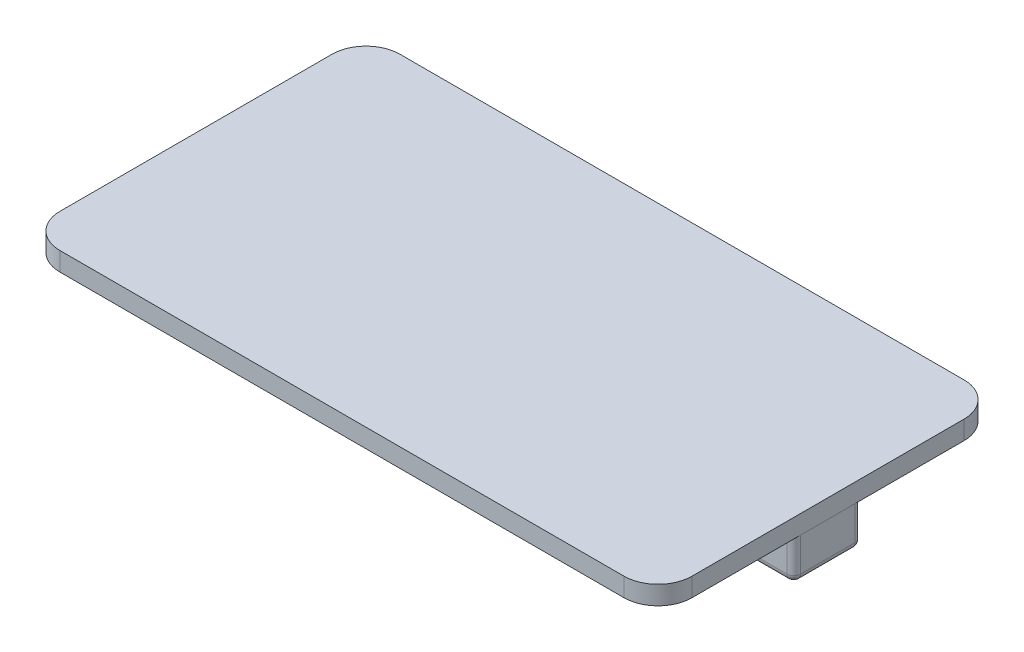
ISO-10303-21;
HEADER;
FILE_DESCRIPTION(('STEP AP214'),'2;1');
FILE_NAME('part.step','',(''),(''),'','','');
FILE_SCHEMA(('AUTOMOTIVE_DESIGN { 1 0 10303 214 1 1 1 1 }'));
ENDSEC;
DATA;
#1=APPLICATION_CONTEXT('core data for automotive mechanical design processes');
#2=APPLICATION_PROTOCOL_DEFINITION('international standard','automotive_design',2000,#1);
#3=PRODUCT_CONTEXT('',#1,'mechanical');
#4=PRODUCT('Part','Part','',(#3));
#5=PRODUCT_RELATED_PRODUCT_CATEGORY('part','',(#4));
#6=PRODUCT_DEFINITION_FORMATION('','',#4);
#7=PRODUCT_DEFINITION_CONTEXT('part definition',#1,'design');
#8=PRODUCT_DEFINITION('design','',#6,#7);
#9=PRODUCT_DEFINITION_SHAPE('','',#8);
#10=(LENGTH_UNIT() NAMED_UNIT(*) SI_UNIT(.MILLI.,.METRE.));
#11=(NAMED_UNIT(*) PLANE_ANGLE_UNIT() SI_UNIT($,.RADIAN.));
#12=(NAMED_UNIT(*) SI_UNIT($,.STERADIAN.) SOLID_ANGLE_UNIT());
#13=UNCERTAINTY_MEASURE_WITH_UNIT(LENGTH_MEASURE(1.E-05),#10,'distance_accuracy_value','');
#14=(GEOMETRIC_REPRESENTATION_CONTEXT(3) GLOBAL_UNCERTAINTY_ASSIGNED_CONTEXT((#13)) GLOBAL_UNIT_ASSIGNED_CONTEXT((#10,
#11,#12)) REPRESENTATION_CONTEXT('',''));
#15=CARTESIAN_POINT('',(0.,0.,0.));
#16=DIRECTION('',(0.,0.,1.));
#17=DIRECTION('',(1.,0.,0.));
#18=AXIS2_PLACEMENT_3D('',#15,#16,#17);
#19=CARTESIAN_POINT('',(-93.,14.,10.));
#20=DIRECTION('',(0.,0.,-1.));
#21=DIRECTION('',(-1.,0.,0.));
#22=AXIS2_PLACEMENT_3D('',#19,#20,#21);
#23=PLANE('',#22);
#24=DIRECTION('',(1.,0.,0.));
#25=VECTOR('',#24,1.);
#26=CARTESIAN_POINT('',(93.,2.,10.));
#27=LINE('',#26,#25);
#28=CARTESIAN_POINT('',(-91.,2.,10.));
#29=VERTEX_POINT('',#28);
#30=CARTESIAN_POINT('',(91.,2.,10.));
#31=VERTEX_POINT('',#30);
#32=EDGE_CURVE('E334',#29,#31,#27,.T.);
#33=ORIENTED_EDGE('',*,*,#32,.T.);
#34=DIRECTION('',(0.,-1.,0.));
#35=VECTOR('',#34,1.);
#36=CARTESIAN_POINT('',(91.,12.,10.));
#37=LINE('',#36,#35);
#38=CARTESIAN_POINT('',(90.9999999999999,12.,10.));
#39=VERTEX_POINT('',#38);
#40=EDGE_CURVE('E413',#31,#39,#37,.F.);
#41=ORIENTED_EDGE('',*,*,#40,.T.);
#42=DIRECTION('',(1.,0.,0.));
#43=VECTOR('',#42,1.);
#44=CARTESIAN_POINT('',(-93.,12.,10.));
#45=LINE('',#44,#43);
#46=CARTESIAN_POINT('',(-91.,12.,10.));
#47=VERTEX_POINT('',#46);
#48=EDGE_CURVE('E269',#47,#39,#45,.T.);
#49=ORIENTED_EDGE('',*,*,#48,.F.);
#50=DIRECTION('',(0.,-1.,0.));
#51=VECTOR('',#50,1.);
#52=CARTESIAN_POINT('',(-91.,14.,10.));
#53=LINE('',#52,#51);
#54=EDGE_CURVE('E365',#47,#29,#53,.T.);
#55=ORIENTED_EDGE('',*,*,#54,.T.);
#56=EDGE_LOOP('',(#33,#41,#49,#55));
#57=FACE_BOUND('',#56,.T.);
#58=ADVANCED_FACE('F41',(#57),#23,.F.);
#59=CARTESIAN_POINT('',(93.,14.,-10.));
#60=DIRECTION('',(1.,0.,0.));
#61=DIRECTION('',(0.,0.,-1.));
#62=AXIS2_PLACEMENT_3D('',#59,#60,#61);
#63=PLANE('',#62);
#64=DIRECTION('',(0.,0.,1.));
#65=VECTOR('',#64,1.);
#66=CARTESIAN_POINT('',(93.,2.,-10.));
#67=LINE('',#66,#65);
#68=CARTESIAN_POINT('',(93.,2.,8.));
#69=VERTEX_POINT('',#68);
#70=CARTESIAN_POINT('',(93.,2.,-8.));
#71=VERTEX_POINT('',#70);
#72=EDGE_CURVE('E401',#69,#71,#67,.F.);
#73=ORIENTED_EDGE('',*,*,#72,.T.);
#74=DIRECTION('',(0.,-1.,0.));
#75=VECTOR('',#74,1.);
#76=CARTESIAN_POINT('',(93.,14.,-8.));
#77=LINE('',#76,#75);
#78=CARTESIAN_POINT('',(93.,12.,-8.));
#79=VERTEX_POINT('',#78);
#80=EDGE_CURVE('E407',#71,#79,#77,.F.);
#81=ORIENTED_EDGE('',*,*,#80,.T.);
#82=DIRECTION('',(0.,0.,-1.));
#83=VECTOR('',#82,1.);
#84=CARTESIAN_POINT('',(93.,12.,-10.));
#85=LINE('',#84,#83);
#86=CARTESIAN_POINT('',(93.,12.,8.));
#87=VERTEX_POINT('',#86);
#88=EDGE_CURVE('E253',#87,#79,#85,.T.);
#89=ORIENTED_EDGE('',*,*,#88,.F.);
#90=DIRECTION('',(0.,-1.,0.));
#91=VECTOR('',#90,1.);
#92=CARTESIAN_POINT('',(93.,2.,8.));
#93=LINE('',#92,#91);
#94=EDGE_CURVE('E404',#87,#69,#93,.T.);
#95=ORIENTED_EDGE('',*,*,#94,.T.);
#96=EDGE_LOOP('',(#73,#81,#89,#95));
#97=FACE_BOUND('',#96,.T.);
#98=ADVANCED_FACE('F488',(#97),#63,.T.);
#99=CARTESIAN_POINT('',(-93.,14.,-10.));
#100=DIRECTION('',(0.,0.,-1.));
#101=DIRECTION('',(-1.,0.,0.));
#102=AXIS2_PLACEMENT_3D('',#99,#100,#101);
#103=PLANE('',#102);
#104=DIRECTION('',(-1.,0.,0.));
#105=VECTOR('',#104,1.);
#106=CARTESIAN_POINT('',(-93.,12.,-10.));
#107=LINE('',#106,#105);
#108=CARTESIAN_POINT('',(90.9999999999999,12.,-10.));
#109=VERTEX_POINT('',#108);
#110=CARTESIAN_POINT('',(-91.,12.,-10.));
#111=VERTEX_POINT('',#110);
#112=EDGE_CURVE('E262',#109,#111,#107,.T.);
#113=ORIENTED_EDGE('',*,*,#112,.F.);
#114=DIRECTION('',(0.,-1.,0.));
#115=VECTOR('',#114,1.);
#116=CARTESIAN_POINT('',(91.,14.,-10.));
#117=LINE('',#116,#115);
#118=CARTESIAN_POINT('',(91.,2.,-10.));
#119=VERTEX_POINT('',#118);
#120=EDGE_CURVE('E381',#109,#119,#117,.T.);
#121=ORIENTED_EDGE('',*,*,#120,.T.);
#122=DIRECTION('',(1.,0.,0.));
#123=VECTOR('',#122,1.);
#124=CARTESIAN_POINT('',(-93.,2.,-10.));
#125=LINE('',#124,#123);
#126=CARTESIAN_POINT('',(-91.,2.,-10.));
#127=VERTEX_POINT('',#126);
#128=EDGE_CURVE('E331',#119,#127,#125,.F.);
#129=ORIENTED_EDGE('',*,*,#128,.T.);
#130=DIRECTION('',(0.,-1.,0.));
#131=VECTOR('',#130,1.);
#132=CARTESIAN_POINT('',(-91.,12.,-10.));
#133=LINE('',#132,#131);
#134=EDGE_CURVE('E350',#127,#111,#133,.F.);
#135=ORIENTED_EDGE('',*,*,#134,.T.);
#136=EDGE_LOOP('',(#113,#121,#129,#135));
#137=FACE_BOUND('',#136,.T.);
#138=ADVANCED_FACE('F482',(#137),#103,.T.);
#139=CARTESIAN_POINT('',(-93.,14.,-10.));
#140=DIRECTION('',(1.,0.,0.));
#141=DIRECTION('',(0.,0.,-1.));
#142=AXIS2_PLACEMENT_3D('',#139,#140,#141);
#143=PLANE('',#142);
#144=DIRECTION('',(0.,0.,1.));
#145=VECTOR('',#144,1.);
#146=CARTESIAN_POINT('',(-93.,12.,-10.));
#147=LINE('',#146,#145);
#148=CARTESIAN_POINT('',(-93.,12.,-8.));
#149=VERTEX_POINT('',#148);
#150=CARTESIAN_POINT('',(-93.,12.,8.));
#151=VERTEX_POINT('',#150);
#152=EDGE_CURVE('E265',#149,#151,#147,.T.);
#153=ORIENTED_EDGE('',*,*,#152,.F.);
#154=DIRECTION('',(0.,-1.,0.));
#155=VECTOR('',#154,1.);
#156=CARTESIAN_POINT('',(-93.,2.,-8.));
#157=LINE('',#156,#155);
#158=CARTESIAN_POINT('',(-93.,2.,-8.));
#159=VERTEX_POINT('',#158);
#160=EDGE_CURVE('E346',#149,#159,#157,.T.);
#161=ORIENTED_EDGE('',*,*,#160,.T.);
#162=DIRECTION('',(0.,0.,1.));
#163=VECTOR('',#162,1.);
#164=CARTESIAN_POINT('',(-93.,2.,8.));
#165=LINE('',#164,#163);
#166=CARTESIAN_POINT('',(-93.,2.,8.));
#167=VERTEX_POINT('',#166);
#168=EDGE_CURVE('E340',#159,#167,#165,.T.);
#169=ORIENTED_EDGE('',*,*,#168,.T.);
#170=DIRECTION('',(0.,-1.,0.));
#171=VECTOR('',#170,1.);
#172=CARTESIAN_POINT('',(-93.,14.,8.));
#173=LINE('',#172,#171);
#174=EDGE_CURVE('E343',#167,#151,#173,.F.);
#175=ORIENTED_EDGE('',*,*,#174,.T.);
#176=EDGE_LOOP('',(#153,#161,#169,#175));
#177=FACE_BOUND('',#176,.T.);
#178=ADVANCED_FACE('F502',(#177),#143,.F.);
#179=CARTESIAN_POINT('',(0.,0.,0.));
#180=DIRECTION('',(0.,-1.,0.));
#181=DIRECTION('',(0.,0.,-1.));
#182=AXIS2_PLACEMENT_3D('',#179,#180,#181);
#183=PLANE('',#182);
#184=DIRECTION('',(0.,0.,1.));
#185=VECTOR('',#184,1.);
#186=CARTESIAN_POINT('',(88.5,0.,5.5));
#187=LINE('',#186,#185);
#188=CARTESIAN_POINT('',(88.5,0.,-5.5));
#189=VERTEX_POINT('',#188);
#190=CARTESIAN_POINT('',(88.5,0.,5.5));
#191=VERTEX_POINT('',#190);
#192=EDGE_CURVE('E207',#189,#191,#187,.T.);
#193=ORIENTED_EDGE('',*,*,#192,.F.);
#194=DIRECTION('',(1.,0.,0.));
#195=VECTOR('',#194,1.);
#196=CARTESIAN_POINT('',(-88.5,0.,-5.5));
#197=LINE('',#196,#195);
#198=CARTESIAN_POINT('',(-88.5,0.,-5.5));
#199=VERTEX_POINT('',#198);
#200=EDGE_CURVE('E227',#199,#189,#197,.T.);
#201=ORIENTED_EDGE('',*,*,#200,.F.);
#202=DIRECTION('',(0.,0.,-1.));
#203=VECTOR('',#202,1.);
#204=CARTESIAN_POINT('',(-88.5,0.,5.5));
#205=LINE('',#204,#203);
#206=CARTESIAN_POINT('',(-88.5,0.,5.5));
#207=VERTEX_POINT('',#206);
#208=EDGE_CURVE('E231',#207,#199,#205,.T.);
#209=ORIENTED_EDGE('',*,*,#208,.F.);
#210=DIRECTION('',(-1.,0.,0.));
#211=VECTOR('',#210,1.);
#212=CARTESIAN_POINT('',(-88.5,0.,5.5));
#213=LINE('',#212,#211);
#214=EDGE_CURVE('E243',#191,#207,#213,.T.);
#215=ORIENTED_EDGE('',*,*,#214,.F.);
#216=EDGE_LOOP('',(#193,#201,#209,#215));
#217=FACE_BOUND('',#216,.T.);
#218=DIRECTION('',(1.,0.,0.));
#219=VECTOR('',#218,1.);
#220=CARTESIAN_POINT('',(0.,0.,-8.));
#221=LINE('',#220,#219);
#222=CARTESIAN_POINT('',(-91.,0.,-8.));
#223=VERTEX_POINT('',#222);
#224=CARTESIAN_POINT('',(91.,0.,-8.));
#225=VERTEX_POINT('',#224);
#226=EDGE_CURVE('E328',#223,#225,#221,.T.);
#227=ORIENTED_EDGE('',*,*,#226,.T.);
#228=DIRECTION('',(0.,0.,1.));
#229=VECTOR('',#228,1.);
#230=CARTESIAN_POINT('',(91.,0.,0.));
#231=LINE('',#230,#229);
#232=CARTESIAN_POINT('',(91.,0.,8.));
#233=VERTEX_POINT('',#232);
#234=EDGE_CURVE('E59',#225,#233,#231,.T.);
#235=ORIENTED_EDGE('',*,*,#234,.T.);
#236=DIRECTION('',(1.,0.,0.));
#237=VECTOR('',#236,1.);
#238=CARTESIAN_POINT('',(-93.,0.,8.));
#239=LINE('',#238,#237);
#240=CARTESIAN_POINT('',(-91.,0.,8.));
#241=VERTEX_POINT('',#240);
#242=EDGE_CURVE('E337',#233,#241,#239,.F.);
#243=ORIENTED_EDGE('',*,*,#242,.T.);
#244=DIRECTION('',(0.,0.,1.));
#245=VECTOR('',#244,1.);
#246=CARTESIAN_POINT('',(-91.,0.,-8.));
#247=LINE('',#246,#245);
#248=EDGE_CURVE('E372',#241,#223,#247,.F.);
#249=ORIENTED_EDGE('',*,*,#248,.T.);
#250=EDGE_LOOP('',(#227,#235,#243,#249));
#251=FACE_BOUND('',#250,.T.);
#252=ADVANCED_FACE('F469',(#217,#251),#183,.T.);
#253=CARTESIAN_POINT('',(0.,12.,0.));
#254=DIRECTION('',(0.,1.,0.));
#255=DIRECTION('',(0.,0.,1.));
#256=AXIS2_PLACEMENT_3D('',#253,#254,#255);
#257=PLANE('',#256);
#258=DIRECTION('',(0.,0.,1.));
#259=VECTOR('',#258,1.);
#260=CARTESIAN_POINT('',(-92.7998455997515,12.,-50.));
#261=LINE('',#260,#259);
#262=CARTESIAN_POINT('',(-92.7998455997515,12.,-8.87209851338898));
#263=VERTEX_POINT('',#262);
#264=CARTESIAN_POINT('',(-92.7998455997515,12.,8.87209851338898));
#265=VERTEX_POINT('',#264);
#266=EDGE_CURVE('E273',#263,#265,#261,.T.);
#267=ORIENTED_EDGE('',*,*,#266,.F.);
#268=CARTESIAN_POINT('',(-91.,12.,-8.));
#269=DIRECTION('',(0.,1.,0.));
#270=DIRECTION('',(0.,0.,1.));
#271=AXIS2_PLACEMENT_3D('',#268,#269,#270);
#272=CIRCLE('',#271,2.);
#273=EDGE_CURVE('E358',#263,#149,#272,.T.);
#274=ORIENTED_EDGE('',*,*,#273,.T.);
#275=ORIENTED_EDGE('',*,*,#152,.T.);
#276=CARTESIAN_POINT('',(-91.,12.,8.));
#277=DIRECTION('',(0.,1.,0.));
#278=DIRECTION('',(0.,0.,1.));
#279=AXIS2_PLACEMENT_3D('',#276,#277,#278);
#280=CIRCLE('',#279,2.);
#281=EDGE_CURVE('E354',#151,#265,#280,.T.);
#282=ORIENTED_EDGE('',*,*,#281,.T.);
#283=EDGE_LOOP('',(#267,#274,#275,#282));
#284=FACE_BOUND('',#283,.T.);
#285=ADVANCED_FACE('F498',(#284),#257,.T.);
#286=CARTESIAN_POINT('',(88.5,4.,5.5));
#287=DIRECTION('',(1.,0.,0.));
#288=DIRECTION('',(0.,0.,-1.));
#289=AXIS2_PLACEMENT_3D('',#286,#287,#288);
#290=PLANE('',#289);
#291=ORIENTED_EDGE('',*,*,#192,.T.);
#292=DIRECTION('',(0.,-1.,0.));
#293=VECTOR('',#292,1.);
#294=CARTESIAN_POINT('',(88.5,4.,5.5));
#295=LINE('',#294,#293);
#296=CARTESIAN_POINT('',(88.5,4.,5.5));
#297=VERTEX_POINT('',#296);
#298=EDGE_CURVE('E200',#297,#191,#295,.T.);
#299=ORIENTED_EDGE('',*,*,#298,.F.);
#300=DIRECTION('',(0.,0.,1.));
#301=VECTOR('',#300,1.);
#302=CARTESIAN_POINT('',(88.5,4.,5.5));
#303=LINE('',#302,#301);
#304=CARTESIAN_POINT('',(88.5,4.,-5.5));
#305=VERTEX_POINT('',#304);
#306=EDGE_CURVE('E204',#305,#297,#303,.T.);
#307=ORIENTED_EDGE('',*,*,#306,.F.);
#308=DIRECTION('',(0.,-1.,0.));
#309=VECTOR('',#308,1.);
#310=CARTESIAN_POINT('',(88.5,4.,-5.5));
#311=LINE('',#310,#309);
#312=EDGE_CURVE('E250',#305,#189,#311,.T.);
#313=ORIENTED_EDGE('',*,*,#312,.T.);
#314=EDGE_LOOP('',(#291,#299,#307,#313));
#315=FACE_BOUND('',#314,.T.);
#316=ADVANCED_FACE('F202',(#315),#290,.F.);
#317=CARTESIAN_POINT('',(-88.5,4.,-5.5));
#318=DIRECTION('',(0.,0.,-1.));
#319=DIRECTION('',(-1.,0.,0.));
#320=AXIS2_PLACEMENT_3D('',#317,#318,#319);
#321=PLANE('',#320);
#322=ORIENTED_EDGE('',*,*,#200,.T.);
#323=ORIENTED_EDGE('',*,*,#312,.F.);
#324=DIRECTION('',(1.,0.,0.));
#325=VECTOR('',#324,1.);
#326=CARTESIAN_POINT('',(-88.5,4.,-5.5));
#327=LINE('',#326,#325);
#328=CARTESIAN_POINT('',(-88.5,4.,-5.5));
#329=VERTEX_POINT('',#328);
#330=EDGE_CURVE('E213',#329,#305,#327,.T.);
#331=ORIENTED_EDGE('',*,*,#330,.F.);
#332=DIRECTION('',(0.,-1.,0.));
#333=VECTOR('',#332,1.);
#334=CARTESIAN_POINT('',(-88.5,4.,-5.5));
#335=LINE('',#334,#333);
#336=EDGE_CURVE('E254',#329,#199,#335,.T.);
#337=ORIENTED_EDGE('',*,*,#336,.T.);
#338=EDGE_LOOP('',(#322,#323,#331,#337));
#339=FACE_BOUND('',#338,.T.);
#340=ADVANCED_FACE('F739',(#339),#321,.F.);
#341=CARTESIAN_POINT('',(-88.5,4.,5.5));
#342=DIRECTION('',(-1.,0.,0.));
#343=DIRECTION('',(0.,0.,1.));
#344=AXIS2_PLACEMENT_3D('',#341,#342,#343);
#345=PLANE('',#344);
#346=ORIENTED_EDGE('',*,*,#208,.T.);
#347=ORIENTED_EDGE('',*,*,#336,.F.);
#348=DIRECTION('',(0.,0.,-1.));
#349=VECTOR('',#348,1.);
#350=CARTESIAN_POINT('',(-88.5,4.,5.5));
#351=LINE('',#350,#349);
#352=CARTESIAN_POINT('',(-88.5,4.,5.5));
#353=VERTEX_POINT('',#352);
#354=EDGE_CURVE('E222',#353,#329,#351,.T.);
#355=ORIENTED_EDGE('',*,*,#354,.F.);
#356=DIRECTION('',(0.,-1.,0.));
#357=VECTOR('',#356,1.);
#358=CARTESIAN_POINT('',(-88.5,4.,5.5));
#359=LINE('',#358,#357);
#360=EDGE_CURVE('E212',#353,#207,#359,.T.);
#361=ORIENTED_EDGE('',*,*,#360,.T.);
#362=EDGE_LOOP('',(#346,#347,#355,#361));
#363=FACE_BOUND('',#362,.T.);
#364=ADVANCED_FACE('F732',(#363),#345,.F.);
#365=CARTESIAN_POINT('',(-88.5,4.,5.5));
#366=DIRECTION('',(0.,0.,1.));
#367=DIRECTION('',(1.,0.,0.));
#368=AXIS2_PLACEMENT_3D('',#365,#366,#367);
#369=PLANE('',#368);
#370=ORIENTED_EDGE('',*,*,#214,.T.);
#371=ORIENTED_EDGE('',*,*,#360,.F.);
#372=DIRECTION('',(-1.,0.,0.));
#373=VECTOR('',#372,1.);
#374=CARTESIAN_POINT('',(-88.5,4.,5.5));
#375=LINE('',#374,#373);
#376=EDGE_CURVE('E216',#297,#353,#375,.T.);
#377=ORIENTED_EDGE('',*,*,#376,.F.);
#378=ORIENTED_EDGE('',*,*,#298,.T.);
#379=EDGE_LOOP('',(#370,#371,#377,#378));
#380=FACE_BOUND('',#379,.T.);
#381=ADVANCED_FACE('F217',(#380),#369,.F.);
#382=CARTESIAN_POINT('',(0.,4.,0.));
#383=DIRECTION('',(0.,-1.,0.));
#384=DIRECTION('',(0.,0.,-1.));
#385=AXIS2_PLACEMENT_3D('',#382,#383,#384);
#386=PLANE('',#385);
#387=CARTESIAN_POINT('',(-72.,4.,0.));
#388=DIRECTION('',(0.,-1.,0.));
#389=DIRECTION('',(0.,0.,-1.));
#390=AXIS2_PLACEMENT_3D('',#387,#388,#389);
#391=CIRCLE('',#390,2.75000000000001);
#392=CARTESIAN_POINT('',(-72.,4.,-2.75000000000001));
#393=VERTEX_POINT('',#392);
#394=EDGE_CURVE('E885',#393,#393,#391,.T.);
#395=ORIENTED_EDGE('',*,*,#394,.F.);
#396=EDGE_LOOP('',(#395));
#397=FACE_BOUND('',#396,.T.);
#398=CARTESIAN_POINT('',(-38.,4.,0.));
#399=DIRECTION('',(0.,-1.,0.));
#400=DIRECTION('',(0.,0.,-1.));
#401=AXIS2_PLACEMENT_3D('',#398,#399,#400);
#402=CIRCLE('',#401,2.75);
#403=CARTESIAN_POINT('',(-38.,4.,-2.75));
#404=VERTEX_POINT('',#403);
#405=EDGE_CURVE('E889',#404,#404,#402,.T.);
#406=ORIENTED_EDGE('',*,*,#405,.F.);
#407=EDGE_LOOP('',(#406));
#408=FACE_BOUND('',#407,.T.);
#409=CARTESIAN_POINT('',(38.,4.,0.));
#410=DIRECTION('',(0.,-1.,0.));
#411=DIRECTION('',(0.,0.,-1.));
#412=AXIS2_PLACEMENT_3D('',#409,#410,#411);
#413=CIRCLE('',#412,2.75);
#414=CARTESIAN_POINT('',(38.,4.,-2.75));
#415=VERTEX_POINT('',#414);
#416=EDGE_CURVE('E893',#415,#415,#413,.T.);
#417=ORIENTED_EDGE('',*,*,#416,.F.);
#418=EDGE_LOOP('',(#417));
#419=FACE_BOUND('',#418,.T.);
#420=CARTESIAN_POINT('',(72.,4.,0.));
#421=DIRECTION('',(0.,-1.,0.));
#422=DIRECTION('',(0.,0.,-1.));
#423=AXIS2_PLACEMENT_3D('',#420,#421,#422);
#424=CIRCLE('',#423,2.75000000000001);
#425=CARTESIAN_POINT('',(72.,4.,-2.75000000000001));
#426=VERTEX_POINT('',#425);
#427=EDGE_CURVE('E234',#426,#426,#424,.T.);
#428=ORIENTED_EDGE('',*,*,#427,.F.);
#429=EDGE_LOOP('',(#428));
#430=FACE_BOUND('',#429,.T.);
#431=ORIENTED_EDGE('',*,*,#306,.T.);
#432=ORIENTED_EDGE('',*,*,#376,.T.);
#433=ORIENTED_EDGE('',*,*,#354,.T.);
#434=ORIENTED_EDGE('',*,*,#330,.T.);
#435=EDGE_LOOP('',(#431,#432,#433,#434));
#436=FACE_BOUND('',#435,.T.);
#437=ADVANCED_FACE('F224',(#397,#408,#419,#430,#436),#386,.T.);
#438=CARTESIAN_POINT('',(72.,9.5,0.));
#439=DIRECTION('',(0.,-1.,0.));
#440=DIRECTION('',(0.,0.,-1.));
#441=AXIS2_PLACEMENT_3D('',#438,#439,#440);
#442=CYLINDRICAL_SURFACE('',#441,2.75000000000001);
#443=CARTESIAN_POINT('',(72.,9.5,0.));
#444=DIRECTION('',(0.,-1.,0.));
#445=DIRECTION('',(0.,0.,-1.));
#446=AXIS2_PLACEMENT_3D('',#443,#444,#445);
#447=CIRCLE('',#446,2.75000000000001);
#448=CARTESIAN_POINT('',(72.,9.5,-2.75000000000001));
#449=VERTEX_POINT('',#448);
#450=EDGE_CURVE('E898',#449,#449,#447,.T.);
#451=ORIENTED_EDGE('',*,*,#450,.F.);
#452=EDGE_LOOP('',(#451));
#453=FACE_BOUND('',#452,.T.);
#454=ORIENTED_EDGE('',*,*,#427,.T.);
#455=EDGE_LOOP('',(#454));
#456=FACE_BOUND('',#455,.T.);
#457=ADVANCED_FACE('F710',(#453,#456),#442,.F.);
#458=CARTESIAN_POINT('',(72.,9.5,0.));
#459=DIRECTION('',(0.,-1.,0.));
#460=DIRECTION('',(0.,0.,-1.));
#461=AXIS2_PLACEMENT_3D('',#458,#459,#460);
#462=PLANE('',#461);
#463=ORIENTED_EDGE('',*,*,#450,.T.);
#464=EDGE_LOOP('',(#463));
#465=FACE_BOUND('',#464,.T.);
#466=ADVANCED_FACE('F702',(#465),#462,.T.);
#467=CARTESIAN_POINT('',(38.,9.5,0.));
#468=DIRECTION('',(0.,-1.,0.));
#469=DIRECTION('',(0.,0.,-1.));
#470=AXIS2_PLACEMENT_3D('',#467,#468,#469);
#471=CYLINDRICAL_SURFACE('',#470,2.75);
#472=CARTESIAN_POINT('',(38.,9.5,0.));
#473=DIRECTION('',(0.,-1.,0.));
#474=DIRECTION('',(0.,0.,-1.));
#475=AXIS2_PLACEMENT_3D('',#472,#473,#474);
#476=CIRCLE('',#475,2.75);
#477=CARTESIAN_POINT('',(38.,9.5,-2.75));
#478=VERTEX_POINT('',#477);
#479=EDGE_CURVE('E939',#478,#478,#476,.T.);
#480=ORIENTED_EDGE('',*,*,#479,.F.);
#481=EDGE_LOOP('',(#480));
#482=FACE_BOUND('',#481,.T.);
#483=ORIENTED_EDGE('',*,*,#416,.T.);
#484=EDGE_LOOP('',(#483));
#485=FACE_BOUND('',#484,.T.);
#486=ADVANCED_FACE('F694',(#482,#485),#471,.F.);
#487=CARTESIAN_POINT('',(38.,9.5,0.));
#488=DIRECTION('',(0.,-1.,0.));
#489=DIRECTION('',(0.,0.,-1.));
#490=AXIS2_PLACEMENT_3D('',#487,#488,#489);
#491=PLANE('',#490);
#492=ORIENTED_EDGE('',*,*,#479,.T.);
#493=EDGE_LOOP('',(#492));
#494=FACE_BOUND('',#493,.T.);
#495=ADVANCED_FACE('F686',(#494),#491,.T.);
#496=CARTESIAN_POINT('',(-38.,9.5,0.));
#497=DIRECTION('',(0.,-1.,0.));
#498=DIRECTION('',(0.,0.,-1.));
#499=AXIS2_PLACEMENT_3D('',#496,#497,#498);
#500=CYLINDRICAL_SURFACE('',#499,2.75);
#501=CARTESIAN_POINT('',(-38.,9.5,0.));
#502=DIRECTION('',(0.,-1.,0.));
#503=DIRECTION('',(0.,0.,-1.));
#504=AXIS2_PLACEMENT_3D('',#501,#502,#503);
#505=CIRCLE('',#504,2.75);
#506=CARTESIAN_POINT('',(-38.,9.5,-2.75));
#507=VERTEX_POINT('',#506);
#508=EDGE_CURVE('E933',#507,#507,#505,.T.);
#509=ORIENTED_EDGE('',*,*,#508,.F.);
#510=EDGE_LOOP('',(#509));
#511=FACE_BOUND('',#510,.T.);
#512=ORIENTED_EDGE('',*,*,#405,.T.);
#513=EDGE_LOOP('',(#512));
#514=FACE_BOUND('',#513,.T.);
#515=ADVANCED_FACE('F678',(#511,#514),#500,.F.);
#516=CARTESIAN_POINT('',(-38.,9.5,0.));
#517=DIRECTION('',(0.,-1.,0.));
#518=DIRECTION('',(0.,0.,-1.));
#519=AXIS2_PLACEMENT_3D('',#516,#517,#518);
#520=PLANE('',#519);
#521=ORIENTED_EDGE('',*,*,#508,.T.);
#522=EDGE_LOOP('',(#521));
#523=FACE_BOUND('',#522,.T.);
#524=ADVANCED_FACE('F670',(#523),#520,.T.);
#525=CARTESIAN_POINT('',(-72.,9.5,0.));
#526=DIRECTION('',(0.,-1.,0.));
#527=DIRECTION('',(0.,0.,-1.));
#528=AXIS2_PLACEMENT_3D('',#525,#526,#527);
#529=CYLINDRICAL_SURFACE('',#528,2.75000000000001);
#530=CARTESIAN_POINT('',(-72.,9.5,0.));
#531=DIRECTION('',(0.,-1.,0.));
#532=DIRECTION('',(0.,0.,-1.));
#533=AXIS2_PLACEMENT_3D('',#530,#531,#532);
#534=CIRCLE('',#533,2.75000000000001);
#535=CARTESIAN_POINT('',(-72.,9.5,-2.75000000000001));
#536=VERTEX_POINT('',#535);
#537=EDGE_CURVE('E244',#536,#536,#534,.T.);
#538=ORIENTED_EDGE('',*,*,#537,.F.);
#539=EDGE_LOOP('',(#538));
#540=FACE_BOUND('',#539,.T.);
#541=ORIENTED_EDGE('',*,*,#394,.T.);
#542=EDGE_LOOP('',(#541));
#543=FACE_BOUND('',#542,.T.);
#544=ADVANCED_FACE('F662',(#540,#543),#529,.F.);
#545=CARTESIAN_POINT('',(-72.,9.5,0.));
#546=DIRECTION('',(0.,-1.,0.));
#547=DIRECTION('',(0.,0.,-1.));
#548=AXIS2_PLACEMENT_3D('',#545,#546,#547);
#549=PLANE('',#548);
#550=ORIENTED_EDGE('',*,*,#537,.T.);
#551=EDGE_LOOP('',(#550));
#552=FACE_BOUND('',#551,.T.);
#553=ADVANCED_FACE('F655',(#552),#549,.T.);
#554=CARTESIAN_POINT('',(0.,12.,0.));
#555=DIRECTION('',(0.,1.,0.));
#556=DIRECTION('',(0.,0.,1.));
#557=AXIS2_PLACEMENT_3D('',#554,#555,#556);
#558=PLANE('',#557);
#559=CARTESIAN_POINT('',(-92.7998455997515,12.,-40.));
#560=VERTEX_POINT('',#559);
#561=EDGE_CURVE('E279',#560,#263,#261,.T.);
#562=ORIENTED_EDGE('',*,*,#561,.F.);
#563=CARTESIAN_POINT('',(-82.7998455997515,12.,-40.));
#564=DIRECTION('',(0.,1.,0.));
#565=DIRECTION('',(0.,0.,1.));
#566=AXIS2_PLACEMENT_3D('',#563,#564,#565);
#567=CIRCLE('',#566,10.);
#568=CARTESIAN_POINT('',(-82.7998455997515,12.,-50.));
#569=VERTEX_POINT('',#568);
#570=EDGE_CURVE('E319',#560,#569,#567,.F.);
#571=ORIENTED_EDGE('',*,*,#570,.T.);
#572=DIRECTION('',(-1.,0.,0.));
#573=VECTOR('',#572,1.);
#574=CARTESIAN_POINT('',(93.0804195849359,12.,-50.));
#575=LINE('',#574,#573);
#576=CARTESIAN_POINT('',(83.0804195849359,12.,-50.));
#577=VERTEX_POINT('',#576);
#578=EDGE_CURVE('E397',#577,#569,#575,.T.);
#579=ORIENTED_EDGE('',*,*,#578,.F.);
#580=CARTESIAN_POINT('',(83.0804195849359,12.,-40.));
#581=DIRECTION('',(0.,1.,0.));
#582=DIRECTION('',(0.,0.,1.));
#583=AXIS2_PLACEMENT_3D('',#580,#581,#582);
#584=CIRCLE('',#583,10.);
#585=CARTESIAN_POINT('',(93.0804195849359,12.,-40.));
#586=VERTEX_POINT('',#585);
#587=EDGE_CURVE('E306',#577,#586,#584,.F.);
#588=ORIENTED_EDGE('',*,*,#587,.T.);
#589=DIRECTION('',(0.,0.,-1.));
#590=VECTOR('',#589,1.);
#591=CARTESIAN_POINT('',(93.0804195849359,12.,50.));
#592=LINE('',#591,#590);
#593=CARTESIAN_POINT('',(93.0804195849359,12.,40.));
#594=VERTEX_POINT('',#593);
#595=EDGE_CURVE('E923',#594,#586,#592,.T.);
#596=ORIENTED_EDGE('',*,*,#595,.F.);
#597=CARTESIAN_POINT('',(83.0804195849359,12.,40.));
#598=DIRECTION('',(0.,1.,0.));
#599=DIRECTION('',(0.,0.,1.));
#600=AXIS2_PLACEMENT_3D('',#597,#598,#599);
#601=CIRCLE('',#600,10.);
#602=CARTESIAN_POINT('',(83.0804195849359,12.,50.));
#603=VERTEX_POINT('',#602);
#604=EDGE_CURVE('E293',#594,#603,#601,.F.);
#605=ORIENTED_EDGE('',*,*,#604,.T.);
#606=DIRECTION('',(1.,0.,0.));
#607=VECTOR('',#606,1.);
#608=CARTESIAN_POINT('',(-92.7998455997515,12.,50.));
#609=LINE('',#608,#607);
#610=CARTESIAN_POINT('',(-82.7998455997515,12.,50.));
#611=VERTEX_POINT('',#610);
#612=EDGE_CURVE('E919',#611,#603,#609,.T.);
#613=ORIENTED_EDGE('',*,*,#612,.F.);
#614=CARTESIAN_POINT('',(-82.7998455997515,12.,40.));
#615=DIRECTION('',(0.,1.,0.));
#616=DIRECTION('',(0.,0.,1.));
#617=AXIS2_PLACEMENT_3D('',#614,#615,#616);
#618=CIRCLE('',#617,10.);
#619=CARTESIAN_POINT('',(-92.7998455997515,12.,40.));
#620=VERTEX_POINT('',#619);
#621=EDGE_CURVE('E278',#611,#620,#618,.F.);
#622=ORIENTED_EDGE('',*,*,#621,.T.);
#623=EDGE_CURVE('E451',#265,#620,#261,.T.);
#624=ORIENTED_EDGE('',*,*,#623,.F.);
#625=CARTESIAN_POINT('',(-91.,12.,8.));
#626=DIRECTION('',(0.,1.,0.));
#627=DIRECTION('',(0.,0.,1.));
#628=AXIS2_PLACEMENT_3D('',#625,#626,#627);
#629=CIRCLE('',#628,2.);
#630=EDGE_CURVE('E378',#265,#47,#629,.T.);
#631=ORIENTED_EDGE('',*,*,#630,.T.);
#632=ORIENTED_EDGE('',*,*,#48,.T.);
#633=CARTESIAN_POINT('',(91.,12.,8.));
#634=DIRECTION('',(0.,1.,0.));
#635=DIRECTION('',(0.,0.,1.));
#636=AXIS2_PLACEMENT_3D('',#633,#634,#635);
#637=CIRCLE('',#636,2.);
#638=EDGE_CURVE('E11',#39,#87,#637,.T.);
#639=ORIENTED_EDGE('',*,*,#638,.T.);
#640=ORIENTED_EDGE('',*,*,#88,.T.);
#641=CARTESIAN_POINT('',(91.,12.,-8.));
#642=DIRECTION('',(0.,1.,0.));
#643=DIRECTION('',(0.,0.,1.));
#644=AXIS2_PLACEMENT_3D('',#641,#642,#643);
#645=CIRCLE('',#644,2.);
#646=EDGE_CURVE('E51',#79,#109,#645,.T.);
#647=ORIENTED_EDGE('',*,*,#646,.T.);
#648=ORIENTED_EDGE('',*,*,#112,.T.);
#649=CARTESIAN_POINT('',(-91.,12.,-8.));
#650=DIRECTION('',(0.,1.,0.));
#651=DIRECTION('',(0.,0.,1.));
#652=AXIS2_PLACEMENT_3D('',#649,#650,#651);
#653=CIRCLE('',#652,2.);
#654=EDGE_CURVE('E375',#111,#263,#653,.T.);
#655=ORIENTED_EDGE('',*,*,#654,.T.);
#656=EDGE_LOOP('',(#562,#571,#579,#588,#596,#605,#613,#622,#624,#631,#632,#639,#640,#647,#648,#655));
#657=FACE_BOUND('',#656,.T.);
#658=ADVANCED_FACE('F447',(#657),#558,.F.);
#659=CARTESIAN_POINT('',(93.0804195849359,17.5,-50.));
#660=DIRECTION('',(0.,0.,1.));
#661=DIRECTION('',(1.,0.,0.));
#662=AXIS2_PLACEMENT_3D('',#659,#660,#661);
#663=PLANE('',#662);
#664=ORIENTED_EDGE('',*,*,#578,.T.);
#665=DIRECTION('',(0.,-1.,0.));
#666=VECTOR('',#665,1.);
#667=CARTESIAN_POINT('',(-82.7998455997515,17.5,-50.));
#668=LINE('',#667,#666);
#669=CARTESIAN_POINT('',(-82.7998455997515,17.5,-50.));
#670=VERTEX_POINT('',#669);
#671=EDGE_CURVE('E322',#569,#670,#668,.F.);
#672=ORIENTED_EDGE('',*,*,#671,.T.);
#673=DIRECTION('',(-1.,0.,0.));
#674=VECTOR('',#673,1.);
#675=CARTESIAN_POINT('',(93.0804195849359,17.5,-50.));
#676=LINE('',#675,#674);
#677=CARTESIAN_POINT('',(83.0804195849359,17.5,-50.));
#678=VERTEX_POINT('',#677);
#679=EDGE_CURVE('E927',#678,#670,#676,.T.);
#680=ORIENTED_EDGE('',*,*,#679,.F.);
#681=DIRECTION('',(0.,-1.,0.));
#682=VECTOR('',#681,1.);
#683=CARTESIAN_POINT('',(83.0804195849359,17.5,-50.));
#684=LINE('',#683,#682);
#685=EDGE_CURVE('E302',#678,#577,#684,.T.);
#686=ORIENTED_EDGE('',*,*,#685,.T.);
#687=EDGE_LOOP('',(#664,#672,#680,#686));
#688=FACE_BOUND('',#687,.T.);
#689=ADVANCED_FACE('F641',(#688),#663,.F.);
#690=CARTESIAN_POINT('',(-92.7998455997515,17.5,-50.));
#691=DIRECTION('',(1.,0.,0.));
#692=DIRECTION('',(0.,0.,-1.));
#693=AXIS2_PLACEMENT_3D('',#690,#691,#692);
#694=PLANE('',#693);
#695=DIRECTION('',(0.,0.,1.));
#696=VECTOR('',#695,1.);
#697=CARTESIAN_POINT('',(-92.7998455997515,17.5,-50.));
#698=LINE('',#697,#696);
#699=CARTESIAN_POINT('',(-92.7998455997515,17.5,-40.));
#700=VERTEX_POINT('',#699);
#701=CARTESIAN_POINT('',(-92.7998455997515,17.5,40.));
#702=VERTEX_POINT('',#701);
#703=EDGE_CURVE('E910',#700,#702,#698,.T.);
#704=ORIENTED_EDGE('',*,*,#703,.F.);
#705=DIRECTION('',(0.,-1.,0.));
#706=VECTOR('',#705,1.);
#707=CARTESIAN_POINT('',(-92.7998455997515,17.5,-40.));
#708=LINE('',#707,#706);
#709=EDGE_CURVE('E315',#700,#560,#708,.T.);
#710=ORIENTED_EDGE('',*,*,#709,.T.);
#711=ORIENTED_EDGE('',*,*,#561,.T.);
#712=ORIENTED_EDGE('',*,*,#266,.T.);
#713=ORIENTED_EDGE('',*,*,#623,.T.);
#714=DIRECTION('',(0.,-1.,0.));
#715=VECTOR('',#714,1.);
#716=CARTESIAN_POINT('',(-92.7998455997515,17.5,40.));
#717=LINE('',#716,#715);
#718=EDGE_CURVE('E282',#620,#702,#717,.F.);
#719=ORIENTED_EDGE('',*,*,#718,.T.);
#720=EDGE_LOOP('',(#704,#710,#711,#712,#713,#719));
#721=FACE_BOUND('',#720,.T.);
#722=ADVANCED_FACE('F634',(#721),#694,.F.);
#723=CARTESIAN_POINT('',(-92.7998455997515,17.5,50.));
#724=DIRECTION('',(0.,0.,-1.));
#725=DIRECTION('',(-1.,0.,0.));
#726=AXIS2_PLACEMENT_3D('',#723,#724,#725);
#727=PLANE('',#726);
#728=ORIENTED_EDGE('',*,*,#612,.T.);
#729=DIRECTION('',(0.,-1.,0.));
#730=VECTOR('',#729,1.);
#731=CARTESIAN_POINT('',(83.0804195849359,17.5,50.));
#732=LINE('',#731,#730);
#733=CARTESIAN_POINT('',(83.0804195849359,17.5,50.));
#734=VERTEX_POINT('',#733);
#735=EDGE_CURVE('E296',#603,#734,#732,.F.);
#736=ORIENTED_EDGE('',*,*,#735,.T.);
#737=DIRECTION('',(1.,0.,0.));
#738=VECTOR('',#737,1.);
#739=CARTESIAN_POINT('',(-92.7998455997515,17.5,50.));
#740=LINE('',#739,#738);
#741=CARTESIAN_POINT('',(-82.7998455997515,17.5,50.));
#742=VERTEX_POINT('',#741);
#743=EDGE_CURVE('E904',#742,#734,#740,.T.);
#744=ORIENTED_EDGE('',*,*,#743,.F.);
#745=DIRECTION('',(0.,-1.,0.));
#746=VECTOR('',#745,1.);
#747=CARTESIAN_POINT('',(-82.7998455997515,17.5,50.));
#748=LINE('',#747,#746);
#749=EDGE_CURVE('E274',#742,#611,#748,.T.);
#750=ORIENTED_EDGE('',*,*,#749,.T.);
#751=EDGE_LOOP('',(#728,#736,#744,#750));
#752=FACE_BOUND('',#751,.T.);
#753=ADVANCED_FACE('F627',(#752),#727,.F.);
#754=CARTESIAN_POINT('',(93.0804195849359,17.5,50.));
#755=DIRECTION('',(-1.,0.,0.));
#756=DIRECTION('',(0.,0.,1.));
#757=AXIS2_PLACEMENT_3D('',#754,#755,#756);
#758=PLANE('',#757);
#759=ORIENTED_EDGE('',*,*,#595,.T.);
#760=DIRECTION('',(0.,-1.,0.));
#761=VECTOR('',#760,1.);
#762=CARTESIAN_POINT('',(93.0804195849359,17.5,-40.));
#763=LINE('',#762,#761);
#764=CARTESIAN_POINT('',(93.0804195849359,17.5,-40.));
#765=VERTEX_POINT('',#764);
#766=EDGE_CURVE('E309',#586,#765,#763,.F.);
#767=ORIENTED_EDGE('',*,*,#766,.T.);
#768=DIRECTION('',(0.,0.,-1.));
#769=VECTOR('',#768,1.);
#770=CARTESIAN_POINT('',(93.0804195849359,17.5,50.));
#771=LINE('',#770,#769);
#772=CARTESIAN_POINT('',(93.0804195849359,17.5,40.));
#773=VERTEX_POINT('',#772);
#774=EDGE_CURVE('E899',#773,#765,#771,.T.);
#775=ORIENTED_EDGE('',*,*,#774,.F.);
#776=DIRECTION('',(0.,-1.,0.));
#777=VECTOR('',#776,1.);
#778=CARTESIAN_POINT('',(93.0804195849359,17.5,40.));
#779=LINE('',#778,#777);
#780=EDGE_CURVE('E289',#773,#594,#779,.T.);
#781=ORIENTED_EDGE('',*,*,#780,.T.);
#782=EDGE_LOOP('',(#759,#767,#775,#781));
#783=FACE_BOUND('',#782,.T.);
#784=ADVANCED_FACE('F620',(#783),#758,.F.);
#785=CARTESIAN_POINT('',(0.,17.5,0.));
#786=DIRECTION('',(0.,1.,0.));
#787=DIRECTION('',(0.,0.,1.));
#788=AXIS2_PLACEMENT_3D('',#785,#786,#787);
#789=PLANE('',#788);
#790=ORIENTED_EDGE('',*,*,#679,.T.);
#791=CARTESIAN_POINT('',(-82.7998455997515,17.5,-40.));
#792=DIRECTION('',(0.,1.,0.));
#793=DIRECTION('',(0.,0.,1.));
#794=AXIS2_PLACEMENT_3D('',#791,#792,#793);
#795=CIRCLE('',#794,10.);
#796=EDGE_CURVE('E325',#670,#700,#795,.T.);
#797=ORIENTED_EDGE('',*,*,#796,.T.);
#798=ORIENTED_EDGE('',*,*,#703,.T.);
#799=CARTESIAN_POINT('',(-82.7998455997515,17.5,40.));
#800=DIRECTION('',(0.,1.,0.));
#801=DIRECTION('',(0.,0.,1.));
#802=AXIS2_PLACEMENT_3D('',#799,#800,#801);
#803=CIRCLE('',#802,10.);
#804=EDGE_CURVE('E286',#702,#742,#803,.T.);
#805=ORIENTED_EDGE('',*,*,#804,.T.);
#806=ORIENTED_EDGE('',*,*,#743,.T.);
#807=CARTESIAN_POINT('',(83.0804195849359,17.5,40.));
#808=DIRECTION('',(0.,1.,0.));
#809=DIRECTION('',(0.,0.,1.));
#810=AXIS2_PLACEMENT_3D('',#807,#808,#809);
#811=CIRCLE('',#810,10.);
#812=EDGE_CURVE('E299',#734,#773,#811,.T.);
#813=ORIENTED_EDGE('',*,*,#812,.T.);
#814=ORIENTED_EDGE('',*,*,#774,.T.);
#815=CARTESIAN_POINT('',(83.0804195849359,17.5,-40.));
#816=DIRECTION('',(0.,1.,0.));
#817=DIRECTION('',(0.,0.,1.));
#818=AXIS2_PLACEMENT_3D('',#815,#816,#817);
#819=CIRCLE('',#818,10.);
#820=EDGE_CURVE('E312',#765,#678,#819,.T.);
#821=ORIENTED_EDGE('',*,*,#820,.T.);
#822=EDGE_LOOP('',(#790,#797,#798,#805,#806,#813,#814,#821));
#823=FACE_BOUND('',#822,.T.);
#824=ADVANCED_FACE('F523',(#823),#789,.T.);
#825=CARTESIAN_POINT('',(-82.7998455997515,17.5,40.));
#826=DIRECTION('',(0.,-1.,0.));
#827=DIRECTION('',(0.,0.,-1.));
#828=AXIS2_PLACEMENT_3D('',#825,#826,#827);
#829=CYLINDRICAL_SURFACE('',#828,10.);
#830=ORIENTED_EDGE('',*,*,#804,.F.);
#831=ORIENTED_EDGE('',*,*,#718,.F.);
#832=ORIENTED_EDGE('',*,*,#621,.F.);
#833=ORIENTED_EDGE('',*,*,#749,.F.);
#834=EDGE_LOOP('',(#830,#831,#832,#833));
#835=FACE_BOUND('',#834,.T.);
#836=ADVANCED_FACE('F519',(#835),#829,.T.);
#837=CARTESIAN_POINT('',(83.0804195849359,17.5,40.));
#838=DIRECTION('',(0.,-1.,0.));
#839=DIRECTION('',(0.,0.,-1.));
#840=AXIS2_PLACEMENT_3D('',#837,#838,#839);
#841=CYLINDRICAL_SURFACE('',#840,10.);
#842=ORIENTED_EDGE('',*,*,#812,.F.);
#843=ORIENTED_EDGE('',*,*,#735,.F.);
#844=ORIENTED_EDGE('',*,*,#604,.F.);
#845=ORIENTED_EDGE('',*,*,#780,.F.);
#846=EDGE_LOOP('',(#842,#843,#844,#845));
#847=FACE_BOUND('',#846,.T.);
#848=ADVANCED_FACE('F522',(#847),#841,.T.);
#849=CARTESIAN_POINT('',(83.0804195849359,17.5,-40.));
#850=DIRECTION('',(0.,-1.,0.));
#851=DIRECTION('',(0.,0.,-1.));
#852=AXIS2_PLACEMENT_3D('',#849,#850,#851);
#853=CYLINDRICAL_SURFACE('',#852,10.);
#854=ORIENTED_EDGE('',*,*,#820,.F.);
#855=ORIENTED_EDGE('',*,*,#766,.F.);
#856=ORIENTED_EDGE('',*,*,#587,.F.);
#857=ORIENTED_EDGE('',*,*,#685,.F.);
#858=EDGE_LOOP('',(#854,#855,#856,#857));
#859=FACE_BOUND('',#858,.T.);
#860=ADVANCED_FACE('F527',(#859),#853,.T.);
#861=CARTESIAN_POINT('',(-82.7998455997515,17.5,-40.));
#862=DIRECTION('',(0.,-1.,0.));
#863=DIRECTION('',(0.,0.,-1.));
#864=AXIS2_PLACEMENT_3D('',#861,#862,#863);
#865=CYLINDRICAL_SURFACE('',#864,10.);
#866=ORIENTED_EDGE('',*,*,#796,.F.);
#867=ORIENTED_EDGE('',*,*,#671,.F.);
#868=ORIENTED_EDGE('',*,*,#570,.F.);
#869=ORIENTED_EDGE('',*,*,#709,.F.);
#870=EDGE_LOOP('',(#866,#867,#868,#869));
#871=FACE_BOUND('',#870,.T.);
#872=ADVANCED_FACE('F531',(#871),#865,.T.);
#873=CARTESIAN_POINT('',(0.,2.,-8.));
#874=DIRECTION('',(1.,0.,0.));
#875=DIRECTION('',(0.,0.,-1.));
#876=AXIS2_PLACEMENT_3D('',#873,#874,#875);
#877=CYLINDRICAL_SURFACE('',#876,2.);
#878=ORIENTED_EDGE('',*,*,#128,.F.);
#879=CARTESIAN_POINT('',(91.,2.,-8.));
#880=DIRECTION('',(1.,0.,0.));
#881=DIRECTION('',(0.,0.,-1.));
#882=AXIS2_PLACEMENT_3D('',#879,#880,#881);
#883=CIRCLE('',#882,2.);
#884=EDGE_CURVE('E410',#119,#225,#883,.F.);
#885=ORIENTED_EDGE('',*,*,#884,.T.);
#886=ORIENTED_EDGE('',*,*,#226,.F.);
#887=CARTESIAN_POINT('',(-91.,2.,-8.));
#888=DIRECTION('',(1.,0.,0.));
#889=DIRECTION('',(0.,0.,-1.));
#890=AXIS2_PLACEMENT_3D('',#887,#888,#889);
#891=CIRCLE('',#890,2.);
#892=EDGE_CURVE('E361',#223,#127,#891,.T.);
#893=ORIENTED_EDGE('',*,*,#892,.T.);
#894=EDGE_LOOP('',(#878,#885,#886,#893));
#895=FACE_BOUND('',#894,.T.);
#896=ADVANCED_FACE('F472',(#895),#877,.T.);
#897=CARTESIAN_POINT('',(-93.,2.,8.));
#898=DIRECTION('',(-1.,0.,0.));
#899=DIRECTION('',(0.,0.,1.));
#900=AXIS2_PLACEMENT_3D('',#897,#898,#899);
#901=CYLINDRICAL_SURFACE('',#900,2.);
#902=ORIENTED_EDGE('',*,*,#242,.F.);
#903=CARTESIAN_POINT('',(91.,2.,8.));
#904=DIRECTION('',(-1.,0.,0.));
#905=DIRECTION('',(0.,0.,1.));
#906=AXIS2_PLACEMENT_3D('',#903,#904,#905);
#907=CIRCLE('',#906,2.);
#908=EDGE_CURVE('E66',#233,#31,#907,.T.);
#909=ORIENTED_EDGE('',*,*,#908,.T.);
#910=ORIENTED_EDGE('',*,*,#32,.F.);
#911=CARTESIAN_POINT('',(-91.,2.,8.));
#912=DIRECTION('',(-1.,0.,0.));
#913=DIRECTION('',(0.,0.,1.));
#914=AXIS2_PLACEMENT_3D('',#911,#912,#913);
#915=CIRCLE('',#914,2.);
#916=EDGE_CURVE('E368',#29,#241,#915,.F.);
#917=ORIENTED_EDGE('',*,*,#916,.T.);
#918=EDGE_LOOP('',(#902,#909,#910,#917));
#919=FACE_BOUND('',#918,.T.);
#920=ADVANCED_FACE('F458',(#919),#901,.T.);
#921=CARTESIAN_POINT('',(-91.,14.,8.));
#922=DIRECTION('',(0.,-1.,0.));
#923=DIRECTION('',(0.,0.,-1.));
#924=AXIS2_PLACEMENT_3D('',#921,#922,#923);
#925=CYLINDRICAL_SURFACE('',#924,2.);
#926=CARTESIAN_POINT('',(-91.,2.,8.));
#927=DIRECTION('',(0.,-1.,0.));
#928=DIRECTION('',(0.,0.,-1.));
#929=AXIS2_PLACEMENT_3D('',#926,#927,#928);
#930=CIRCLE('',#929,2.);
#931=EDGE_CURVE('E393',#29,#167,#930,.T.);
#932=ORIENTED_EDGE('',*,*,#931,.F.);
#933=ORIENTED_EDGE('',*,*,#54,.F.);
#934=ORIENTED_EDGE('',*,*,#630,.F.);
#935=ORIENTED_EDGE('',*,*,#281,.F.);
#936=ORIENTED_EDGE('',*,*,#174,.F.);
#937=EDGE_LOOP('',(#932,#933,#934,#935,#936));
#938=FACE_BOUND('',#937,.T.);
#939=ADVANCED_FACE('F455',(#938),#925,.T.);
#940=CARTESIAN_POINT('',(-91.,2.,8.));
#941=DIRECTION('',(1.,0.,0.));
#942=DIRECTION('',(0.,0.,-1.));
#943=AXIS2_PLACEMENT_3D('',#940,#941,#942);
#944=SPHERICAL_SURFACE('',#943,2.);
#945=ORIENTED_EDGE('',*,*,#916,.F.);
#946=ORIENTED_EDGE('',*,*,#931,.T.);
#947=CARTESIAN_POINT('',(-91.,2.,8.));
#948=DIRECTION('',(0.,0.,-1.));
#949=DIRECTION('',(-1.,0.,0.));
#950=AXIS2_PLACEMENT_3D('',#947,#948,#949);
#951=CIRCLE('',#950,2.);
#952=EDGE_CURVE('E389',#241,#167,#951,.T.);
#953=ORIENTED_EDGE('',*,*,#952,.F.);
#954=EDGE_LOOP('',(#945,#946,#953));
#955=FACE_BOUND('',#954,.T.);
#956=ADVANCED_FACE('F462',(#955),#944,.T.);
#957=CARTESIAN_POINT('',(-91.,2.,-10.));
#958=DIRECTION('',(0.,0.,-1.));
#959=DIRECTION('',(-1.,0.,0.));
#960=AXIS2_PLACEMENT_3D('',#957,#958,#959);
#961=CYLINDRICAL_SURFACE('',#960,2.);
#962=CARTESIAN_POINT('',(-91.,2.,-8.));
#963=DIRECTION('',(0.,0.,-1.));
#964=DIRECTION('',(-1.,0.,0.));
#965=AXIS2_PLACEMENT_3D('',#962,#963,#964);
#966=CIRCLE('',#965,2.);
#967=EDGE_CURVE('E385',#223,#159,#966,.T.);
#968=ORIENTED_EDGE('',*,*,#967,.F.);
#969=ORIENTED_EDGE('',*,*,#248,.F.);
#970=ORIENTED_EDGE('',*,*,#952,.T.);
#971=ORIENTED_EDGE('',*,*,#168,.F.);
#972=EDGE_LOOP('',(#968,#969,#970,#971));
#973=FACE_BOUND('',#972,.T.);
#974=ADVANCED_FACE('F466',(#973),#961,.T.);
#975=CARTESIAN_POINT('',(-91.,2.,-8.));
#976=DIRECTION('',(1.,0.,0.));
#977=DIRECTION('',(0.,0.,-1.));
#978=AXIS2_PLACEMENT_3D('',#975,#976,#977);
#979=SPHERICAL_SURFACE('',#978,2.);
#980=ORIENTED_EDGE('',*,*,#892,.F.);
#981=ORIENTED_EDGE('',*,*,#967,.T.);
#982=CARTESIAN_POINT('',(-91.,2.,-8.));
#983=DIRECTION('',(0.,1.,0.));
#984=DIRECTION('',(0.,0.,1.));
#985=AXIS2_PLACEMENT_3D('',#982,#983,#984);
#986=CIRCLE('',#985,2.);
#987=EDGE_CURVE('E382',#127,#159,#986,.T.);
#988=ORIENTED_EDGE('',*,*,#987,.F.);
#989=EDGE_LOOP('',(#980,#981,#988));
#990=FACE_BOUND('',#989,.T.);
#991=ADVANCED_FACE('F542',(#990),#979,.T.);
#992=CARTESIAN_POINT('',(-91.,14.,-8.));
#993=DIRECTION('',(0.,1.,0.));
#994=DIRECTION('',(0.,0.,1.));
#995=AXIS2_PLACEMENT_3D('',#992,#993,#994);
#996=CYLINDRICAL_SURFACE('',#995,2.);
#997=ORIENTED_EDGE('',*,*,#654,.F.);
#998=ORIENTED_EDGE('',*,*,#134,.F.);
#999=ORIENTED_EDGE('',*,*,#987,.T.);
#1000=ORIENTED_EDGE('',*,*,#160,.F.);
#1001=ORIENTED_EDGE('',*,*,#273,.F.);
#1002=EDGE_LOOP('',(#997,#998,#999,#1000,#1001));
#1003=FACE_BOUND('',#1002,.T.);
#1004=ADVANCED_FACE('F494',(#1003),#996,.T.);
#1005=CARTESIAN_POINT('',(91.,14.,8.));
#1006=DIRECTION('',(0.,1.,0.));
#1007=DIRECTION('',(0.,0.,1.));
#1008=AXIS2_PLACEMENT_3D('',#1005,#1006,#1007);
#1009=CYLINDRICAL_SURFACE('',#1008,2.);
#1010=ORIENTED_EDGE('',*,*,#638,.F.);
#1011=ORIENTED_EDGE('',*,*,#40,.F.);
#1012=CARTESIAN_POINT('',(91.,2.,8.));
#1013=DIRECTION('',(0.,-1.,0.));
#1014=DIRECTION('',(0.,0.,-1.));
#1015=AXIS2_PLACEMENT_3D('',#1012,#1013,#1014);
#1016=CIRCLE('',#1015,2.);
#1017=EDGE_CURVE('E45',#69,#31,#1016,.T.);
#1018=ORIENTED_EDGE('',*,*,#1017,.F.);
#1019=ORIENTED_EDGE('',*,*,#94,.F.);
#1020=EDGE_LOOP('',(#1010,#1011,#1018,#1019));
#1021=FACE_BOUND('',#1020,.T.);
#1022=ADVANCED_FACE('F43',(#1021),#1009,.T.);
#1023=CARTESIAN_POINT('',(91.,2.,8.));
#1024=DIRECTION('',(1.,0.,0.));
#1025=DIRECTION('',(0.,0.,-1.));
#1026=AXIS2_PLACEMENT_3D('',#1023,#1024,#1025);
#1027=SPHERICAL_SURFACE('',#1026,2.);
#1028=ORIENTED_EDGE('',*,*,#1017,.T.);
#1029=ORIENTED_EDGE('',*,*,#908,.F.);
#1030=CARTESIAN_POINT('',(91.,2.,8.));
#1031=DIRECTION('',(0.,0.,-1.));
#1032=DIRECTION('',(-1.,0.,0.));
#1033=AXIS2_PLACEMENT_3D('',#1030,#1031,#1032);
#1034=CIRCLE('',#1033,2.);
#1035=EDGE_CURVE('E428',#69,#233,#1034,.T.);
#1036=ORIENTED_EDGE('',*,*,#1035,.F.);
#1037=EDGE_LOOP('',(#1028,#1029,#1036));
#1038=FACE_BOUND('',#1037,.T.);
#1039=ADVANCED_FACE('F438',(#1038),#1027,.T.);
#1040=CARTESIAN_POINT('',(91.,2.,0.));
#1041=DIRECTION('',(0.,0.,1.));
#1042=DIRECTION('',(1.,0.,0.));
#1043=AXIS2_PLACEMENT_3D('',#1040,#1041,#1042);
#1044=CYLINDRICAL_SURFACE('',#1043,2.);
#1045=ORIENTED_EDGE('',*,*,#1035,.T.);
#1046=ORIENTED_EDGE('',*,*,#234,.F.);
#1047=CARTESIAN_POINT('',(91.,2.,-8.));
#1048=DIRECTION('',(0.,0.,-1.));
#1049=DIRECTION('',(-1.,0.,0.));
#1050=AXIS2_PLACEMENT_3D('',#1047,#1048,#1049);
#1051=CIRCLE('',#1050,2.);
#1052=EDGE_CURVE('E425',#71,#225,#1051,.T.);
#1053=ORIENTED_EDGE('',*,*,#1052,.F.);
#1054=ORIENTED_EDGE('',*,*,#72,.F.);
#1055=EDGE_LOOP('',(#1045,#1046,#1053,#1054));
#1056=FACE_BOUND('',#1055,.T.);
#1057=ADVANCED_FACE('F556',(#1056),#1044,.T.);
#1058=CARTESIAN_POINT('',(91.,2.,-8.));
#1059=DIRECTION('',(1.,0.,0.));
#1060=DIRECTION('',(0.,0.,-1.));
#1061=AXIS2_PLACEMENT_3D('',#1058,#1059,#1060);
#1062=SPHERICAL_SURFACE('',#1061,2.);
#1063=ORIENTED_EDGE('',*,*,#1052,.T.);
#1064=ORIENTED_EDGE('',*,*,#884,.F.);
#1065=CARTESIAN_POINT('',(91.,2.,-8.));
#1066=DIRECTION('',(0.,1.,0.));
#1067=DIRECTION('',(0.,0.,1.));
#1068=AXIS2_PLACEMENT_3D('',#1065,#1066,#1067);
#1069=CIRCLE('',#1068,2.);
#1070=EDGE_CURVE('E422',#71,#119,#1069,.T.);
#1071=ORIENTED_EDGE('',*,*,#1070,.F.);
#1072=EDGE_LOOP('',(#1063,#1064,#1071));
#1073=FACE_BOUND('',#1072,.T.);
#1074=ADVANCED_FACE('F477',(#1073),#1062,.T.);
#1075=CARTESIAN_POINT('',(91.,14.,-8.));
#1076=DIRECTION('',(0.,-1.,0.));
#1077=DIRECTION('',(0.,0.,-1.));
#1078=AXIS2_PLACEMENT_3D('',#1075,#1076,#1077);
#1079=CYLINDRICAL_SURFACE('',#1078,2.);
#1080=ORIENTED_EDGE('',*,*,#646,.F.);
#1081=ORIENTED_EDGE('',*,*,#80,.F.);
#1082=ORIENTED_EDGE('',*,*,#1070,.T.);
#1083=ORIENTED_EDGE('',*,*,#120,.F.);
#1084=EDGE_LOOP('',(#1080,#1081,#1082,#1083));
#1085=FACE_BOUND('',#1084,.T.);
#1086=ADVANCED_FACE('F485',(#1085),#1079,.T.);
#1087=CLOSED_SHELL('',(#58,#98,#138,#178,#252,#285,#316,#340,#364,#381,#437,#457,#466,#486,#495,
#515,#524,#544,#553,#658,#689,#722,#753,#784,#824,#836,#848,#860,#872,#896,#920,#939,#956,#974,
#991,#1004,#1022,#1039,#1057,#1074,#1086));
#1088=MANIFOLD_SOLID_BREP('B2',#1087);
#1089=ADVANCED_BREP_SHAPE_REPRESENTATION('',(#18,#1088),#14);
#1090=SHAPE_DEFINITION_REPRESENTATION(#9,#1089);
ENDSEC;
END-ISO-10303-21;
